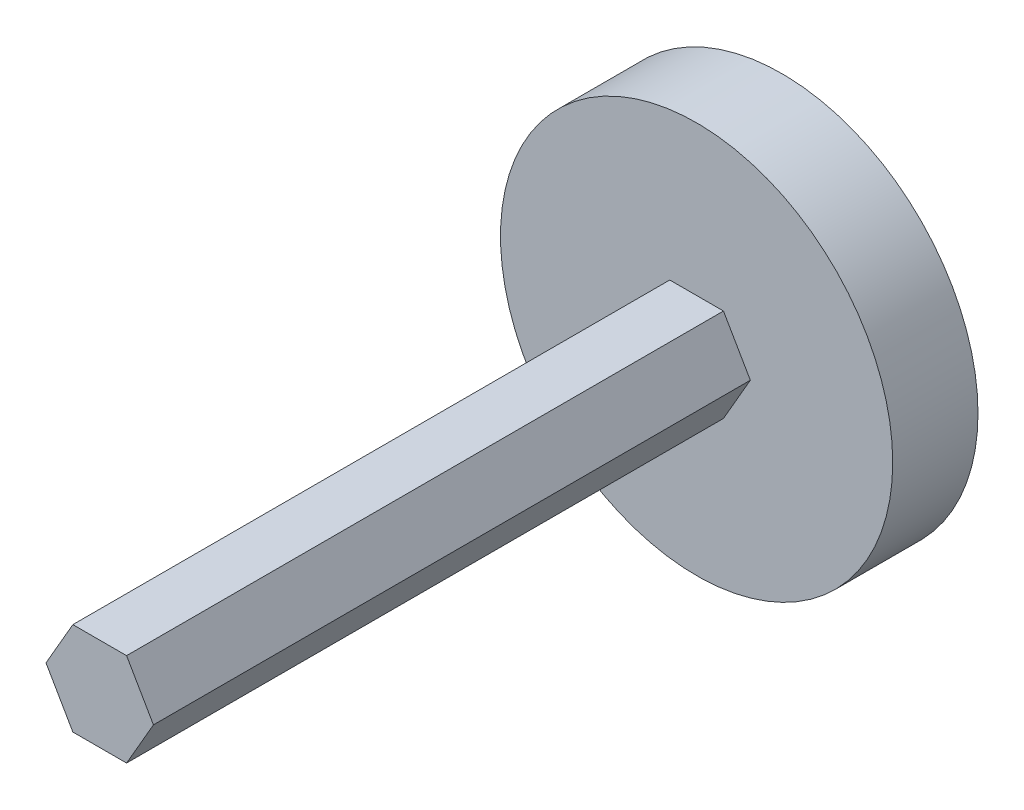
ISO-10303-21;
HEADER;
FILE_DESCRIPTION(('STEP AP214'),'2;1');
FILE_NAME('part.step','',(''),(''),'','','');
FILE_SCHEMA(('AUTOMOTIVE_DESIGN { 1 0 10303 214 1 1 1 1 }'));
ENDSEC;
DATA;
#1=APPLICATION_CONTEXT('core data for automotive mechanical design processes');
#2=APPLICATION_PROTOCOL_DEFINITION('international standard','automotive_design',2000,#1);
#3=PRODUCT_CONTEXT('',#1,'mechanical');
#4=PRODUCT('Part','Part','',(#3));
#5=PRODUCT_RELATED_PRODUCT_CATEGORY('part','',(#4));
#6=PRODUCT_DEFINITION_FORMATION('','',#4);
#7=PRODUCT_DEFINITION_CONTEXT('part definition',#1,'design');
#8=PRODUCT_DEFINITION('design','',#6,#7);
#9=PRODUCT_DEFINITION_SHAPE('','',#8);
#10=(LENGTH_UNIT() NAMED_UNIT(*) SI_UNIT(.MILLI.,.METRE.));
#11=(NAMED_UNIT(*) PLANE_ANGLE_UNIT() SI_UNIT($,.RADIAN.));
#12=(NAMED_UNIT(*) SI_UNIT($,.STERADIAN.) SOLID_ANGLE_UNIT());
#13=UNCERTAINTY_MEASURE_WITH_UNIT(LENGTH_MEASURE(1.E-05),#10,'distance_accuracy_value','');
#14=(GEOMETRIC_REPRESENTATION_CONTEXT(3) GLOBAL_UNCERTAINTY_ASSIGNED_CONTEXT((#13)) GLOBAL_UNIT_ASSIGNED_CONTEXT((#10,
#11,#12)) REPRESENTATION_CONTEXT('',''));
#15=CARTESIAN_POINT('',(0.,0.,0.));
#16=DIRECTION('',(0.,0.,1.));
#17=DIRECTION('',(1.,0.,0.));
#18=AXIS2_PLACEMENT_3D('',#15,#16,#17);
#19=CARTESIAN_POINT('',(0.,0.,10.));
#20=DIRECTION('',(0.,0.,1.));
#21=DIRECTION('',(1.,0.,0.));
#22=AXIS2_PLACEMENT_3D('',#19,#20,#21);
#23=PLANE('',#22);
#24=CARTESIAN_POINT('',(0.,0.,10.));
#25=DIRECTION('',(0.,0.,1.));
#26=DIRECTION('',(1.,0.,0.));
#27=AXIS2_PLACEMENT_3D('',#24,#25,#26);
#28=CIRCLE('',#27,23.);
#29=CARTESIAN_POINT('',(23.,0.,10.));
#30=VERTEX_POINT('',#29);
#31=EDGE_CURVE('E150',#30,#30,#28,.T.);
#32=ORIENTED_EDGE('',*,*,#31,.T.);
#33=EDGE_LOOP('',(#32));
#34=FACE_BOUND('',#33,.T.);
#35=DIRECTION('',(0.5,-0.866025403784439,0.));
#36=VECTOR('',#35,1.);
#37=CARTESIAN_POINT('',(-6.3,0.,10.));
#38=LINE('',#37,#36);
#39=CARTESIAN_POINT('',(-6.3,0.,10.));
#40=VERTEX_POINT('',#39);
#41=CARTESIAN_POINT('',(-3.15,-5.45596004384196,10.));
#42=VERTEX_POINT('',#41);
#43=EDGE_CURVE('E129',#40,#42,#38,.T.);
#44=ORIENTED_EDGE('',*,*,#43,.F.);
#45=DIRECTION('',(-0.5,-0.866025403784439,0.));
#46=VECTOR('',#45,1.);
#47=CARTESIAN_POINT('',(-3.15,5.45596004384196,10.));
#48=LINE('',#47,#46);
#49=CARTESIAN_POINT('',(-3.15,5.45596004384196,10.));
#50=VERTEX_POINT('',#49);
#51=EDGE_CURVE('E63',#50,#40,#48,.T.);
#52=ORIENTED_EDGE('',*,*,#51,.F.);
#53=DIRECTION('',(-1.,0.,0.));
#54=VECTOR('',#53,1.);
#55=CARTESIAN_POINT('',(3.15,5.45596004384196,10.));
#56=LINE('',#55,#54);
#57=CARTESIAN_POINT('',(3.15,5.45596004384196,9.99999999999999));
#58=VERTEX_POINT('',#57);
#59=EDGE_CURVE('E124',#58,#50,#56,.T.);
#60=ORIENTED_EDGE('',*,*,#59,.F.);
#61=DIRECTION('',(-0.5,0.866025403784439,0.));
#62=VECTOR('',#61,1.);
#63=CARTESIAN_POINT('',(6.3,0.,10.));
#64=LINE('',#63,#62);
#65=CARTESIAN_POINT('',(6.3,0.,10.));
#66=VERTEX_POINT('',#65);
#67=EDGE_CURVE('E69',#66,#58,#64,.T.);
#68=ORIENTED_EDGE('',*,*,#67,.F.);
#69=DIRECTION('',(0.5,0.866025403784439,0.));
#70=VECTOR('',#69,1.);
#71=CARTESIAN_POINT('',(3.15,-5.45596004384196,10.));
#72=LINE('',#71,#70);
#73=CARTESIAN_POINT('',(3.15,-5.45596004384196,10.));
#74=VERTEX_POINT('',#73);
#75=EDGE_CURVE('E142',#74,#66,#72,.T.);
#76=ORIENTED_EDGE('',*,*,#75,.F.);
#77=DIRECTION('',(1.,0.,0.));
#78=VECTOR('',#77,1.);
#79=CARTESIAN_POINT('',(-3.15,-5.45596004384196,10.));
#80=LINE('',#79,#78);
#81=EDGE_CURVE('E138',#42,#74,#80,.T.);
#82=ORIENTED_EDGE('',*,*,#81,.F.);
#83=EDGE_LOOP('',(#44,#52,#60,#68,#76,#82));
#84=FACE_BOUND('',#83,.T.);
#85=ADVANCED_FACE('F47',(#34,#84),#23,.T.);
#86=CARTESIAN_POINT('',(0.,0.,0.));
#87=DIRECTION('',(0.,0.,1.));
#88=DIRECTION('',(1.,0.,0.));
#89=AXIS2_PLACEMENT_3D('',#86,#87,#88);
#90=PLANE('',#89);
#91=CARTESIAN_POINT('',(0.,10.,0.));
#92=DIRECTION('',(0.,0.,1.));
#93=DIRECTION('',(1.,0.,0.));
#94=AXIS2_PLACEMENT_3D('',#91,#92,#93);
#95=CIRCLE('',#94,0.500000000000001);
#96=CARTESIAN_POINT('',(0.500000000000001,10.,0.));
#97=VERTEX_POINT('',#96);
#98=EDGE_CURVE('E11',#97,#97,#95,.F.);
#99=ORIENTED_EDGE('',*,*,#98,.F.);
#100=EDGE_LOOP('',(#99));
#101=FACE_BOUND('',#100,.T.);
#102=CARTESIAN_POINT('',(-7.0682595088448,7.073875,0.));
#103=DIRECTION('',(0.,0.,1.));
#104=DIRECTION('',(1.,0.,0.));
#105=AXIS2_PLACEMENT_3D('',#102,#103,#104);
#106=CIRCLE('',#105,0.500000000000002);
#107=CARTESIAN_POINT('',(-6.5682595088448,7.073875,0.));
#108=VERTEX_POINT('',#107);
#109=EDGE_CURVE('E56',#108,#108,#106,.F.);
#110=ORIENTED_EDGE('',*,*,#109,.F.);
#111=EDGE_LOOP('',(#110));
#112=FACE_BOUND('',#111,.T.);
#113=CARTESIAN_POINT('',(7.07948602984036,-7.06263955991633,0.));
#114=DIRECTION('',(0.,0.,1.));
#115=DIRECTION('',(1.,0.,0.));
#116=AXIS2_PLACEMENT_3D('',#113,#114,#115);
#117=CIRCLE('',#116,0.500000000000001);
#118=CARTESIAN_POINT('',(7.57948602984036,-7.06263955991633,0.));
#119=VERTEX_POINT('',#118);
#120=EDGE_CURVE('E177',#119,#119,#117,.F.);
#121=ORIENTED_EDGE('',*,*,#120,.F.);
#122=EDGE_LOOP('',(#121));
#123=FACE_BOUND('',#122,.T.);
#124=CARTESIAN_POINT('',(9.9999968466259,0.00794150312499915,0.));
#125=DIRECTION('',(0.,0.,1.));
#126=DIRECTION('',(1.,0.,0.));
#127=AXIS2_PLACEMENT_3D('',#124,#125,#126);
#128=CIRCLE('',#127,0.500000000000001);
#129=CARTESIAN_POINT('',(10.4999968466259,0.00794150312499915,0.));
#130=VERTEX_POINT('',#129);
#131=EDGE_CURVE('E173',#130,#130,#128,.F.);
#132=ORIENTED_EDGE('',*,*,#131,.F.);
#133=EDGE_LOOP('',(#132));
#134=FACE_BOUND('',#133,.T.);
#135=CARTESIAN_POINT('',(0.0158882464843879,-10.,0.));
#136=DIRECTION('',(0.,0.,1.));
#137=DIRECTION('',(1.,0.,0.));
#138=AXIS2_PLACEMENT_3D('',#135,#136,#137);
#139=CIRCLE('',#138,0.5);
#140=CARTESIAN_POINT('',(0.515888246484388,-10.,0.));
#141=VERTEX_POINT('',#140);
#142=EDGE_CURVE('E169',#141,#141,#139,.F.);
#143=ORIENTED_EDGE('',*,*,#142,.F.);
#144=EDGE_LOOP('',(#143));
#145=FACE_BOUND('',#144,.T.);
#146=CARTESIAN_POINT('',(-7.05700775255605,-7.0850999696803,0.));
#147=DIRECTION('',(0.,0.,1.));
#148=DIRECTION('',(1.,0.,0.));
#149=AXIS2_PLACEMENT_3D('',#146,#147,#148);
#150=CIRCLE('',#149,0.500000000000001);
#151=CARTESIAN_POINT('',(-6.55700775255605,-7.0850999696803,0.));
#152=VERTEX_POINT('',#151);
#153=EDGE_CURVE('E165',#152,#152,#150,.F.);
#154=ORIENTED_EDGE('',*,*,#153,.F.);
#155=EDGE_LOOP('',(#154));
#156=FACE_BOUND('',#155,.T.);
#157=CARTESIAN_POINT('',(-9.96148167686387,-0.00791612135362815,0.));
#158=DIRECTION('',(0.,0.,1.));
#159=DIRECTION('',(1.,0.,0.));
#160=AXIS2_PLACEMENT_3D('',#157,#158,#159);
#161=CIRCLE('',#160,0.500000000000001);
#162=CARTESIAN_POINT('',(-9.46148167686387,-0.00791612135362815,0.));
#163=VERTEX_POINT('',#162);
#164=EDGE_CURVE('E161',#163,#163,#161,.F.);
#165=ORIENTED_EDGE('',*,*,#164,.F.);
#166=EDGE_LOOP('',(#165));
#167=FACE_BOUND('',#166,.T.);
#168=CARTESIAN_POINT('',(7.0682595088448,7.073875,0.));
#169=DIRECTION('',(0.,0.,1.));
#170=DIRECTION('',(1.,0.,0.));
#171=AXIS2_PLACEMENT_3D('',#168,#169,#170);
#172=CIRCLE('',#171,0.500000000000002);
#173=CARTESIAN_POINT('',(7.56825950884481,7.073875,0.));
#174=VERTEX_POINT('',#173);
#175=EDGE_CURVE('E154',#174,#174,#172,.F.);
#176=ORIENTED_EDGE('',*,*,#175,.F.);
#177=EDGE_LOOP('',(#176));
#178=FACE_BOUND('',#177,.T.);
#179=CARTESIAN_POINT('',(0.,0.,0.));
#180=DIRECTION('',(0.,0.,1.));
#181=DIRECTION('',(1.,0.,0.));
#182=AXIS2_PLACEMENT_3D('',#179,#180,#181);
#183=CIRCLE('',#182,23.);
#184=CARTESIAN_POINT('',(23.,0.,0.));
#185=VERTEX_POINT('',#184);
#186=EDGE_CURVE('E149',#185,#185,#183,.T.);
#187=ORIENTED_EDGE('',*,*,#186,.F.);
#188=EDGE_LOOP('',(#187));
#189=FACE_BOUND('',#188,.T.);
#190=ADVANCED_FACE('F186',(#101,#112,#123,#134,#145,#156,#167,#178,#189),#90,.F.);
#191=CARTESIAN_POINT('',(0.,0.,10.));
#192=DIRECTION('',(0.,0.,-1.));
#193=DIRECTION('',(-1.,0.,0.));
#194=AXIS2_PLACEMENT_3D('',#191,#192,#193);
#195=CYLINDRICAL_SURFACE('',#194,23.);
#196=ORIENTED_EDGE('',*,*,#31,.F.);
#197=EDGE_LOOP('',(#196));
#198=FACE_BOUND('',#197,.T.);
#199=ORIENTED_EDGE('',*,*,#186,.T.);
#200=EDGE_LOOP('',(#199));
#201=FACE_BOUND('',#200,.T.);
#202=ADVANCED_FACE('F49',(#198,#201),#195,.T.);
#203=CARTESIAN_POINT('',(0.,5.45596004384196,80.));
#204=DIRECTION('',(0.,-1.,0.));
#205=DIRECTION('',(0.,0.,-1.));
#206=AXIS2_PLACEMENT_3D('',#203,#204,#205);
#207=PLANE('',#206);
#208=ORIENTED_EDGE('',*,*,#59,.T.);
#209=DIRECTION('',(0.,0.,-1.));
#210=VECTOR('',#209,1.);
#211=CARTESIAN_POINT('',(-3.15,5.45596004384196,80.));
#212=LINE('',#211,#210);
#213=CARTESIAN_POINT('',(-3.15,5.45596004384196,80.));
#214=VERTEX_POINT('',#213);
#215=EDGE_CURVE('E104',#214,#50,#212,.T.);
#216=ORIENTED_EDGE('',*,*,#215,.F.);
#217=DIRECTION('',(-1.,0.,0.));
#218=VECTOR('',#217,1.);
#219=CARTESIAN_POINT('',(0.,5.45596004384196,80.));
#220=LINE('',#219,#218);
#221=CARTESIAN_POINT('',(3.15,5.45596004384196,80.));
#222=VERTEX_POINT('',#221);
#223=EDGE_CURVE('E111',#222,#214,#220,.T.);
#224=ORIENTED_EDGE('',*,*,#223,.F.);
#225=DIRECTION('',(0.,0.,-1.));
#226=VECTOR('',#225,1.);
#227=CARTESIAN_POINT('',(3.15,5.45596004384196,80.));
#228=LINE('',#227,#226);
#229=EDGE_CURVE('E345',#222,#58,#228,.T.);
#230=ORIENTED_EDGE('',*,*,#229,.T.);
#231=EDGE_LOOP('',(#208,#216,#224,#230));
#232=FACE_BOUND('',#231,.T.);
#233=ADVANCED_FACE('F123',(#232),#207,.F.);
#234=CARTESIAN_POINT('',(-4.725,2.72798002192098,80.));
#235=DIRECTION('',(0.866025403784439,-0.5,0.));
#236=DIRECTION('',(0.5,0.866025403784439,0.));
#237=AXIS2_PLACEMENT_3D('',#234,#235,#236);
#238=PLANE('',#237);
#239=ORIENTED_EDGE('',*,*,#51,.T.);
#240=DIRECTION('',(0.,0.,-1.));
#241=VECTOR('',#240,1.);
#242=CARTESIAN_POINT('',(-6.3,0.,80.));
#243=LINE('',#242,#241);
#244=CARTESIAN_POINT('',(-6.3,0.,80.));
#245=VERTEX_POINT('',#244);
#246=EDGE_CURVE('E106',#245,#40,#243,.T.);
#247=ORIENTED_EDGE('',*,*,#246,.F.);
#248=DIRECTION('',(-0.5,-0.866025403784439,0.));
#249=VECTOR('',#248,1.);
#250=CARTESIAN_POINT('',(-4.725,2.72798002192098,80.));
#251=LINE('',#250,#249);
#252=EDGE_CURVE('E100',#214,#245,#251,.T.);
#253=ORIENTED_EDGE('',*,*,#252,.F.);
#254=ORIENTED_EDGE('',*,*,#215,.T.);
#255=EDGE_LOOP('',(#239,#247,#253,#254));
#256=FACE_BOUND('',#255,.T.);
#257=ADVANCED_FACE('F102',(#256),#238,.F.);
#258=CARTESIAN_POINT('',(-4.725,-2.72798002192098,80.));
#259=DIRECTION('',(0.866025403784439,0.5,0.));
#260=DIRECTION('',(-0.5,0.866025403784439,0.));
#261=AXIS2_PLACEMENT_3D('',#258,#259,#260);
#262=PLANE('',#261);
#263=ORIENTED_EDGE('',*,*,#43,.T.);
#264=DIRECTION('',(0.,0.,-1.));
#265=VECTOR('',#264,1.);
#266=CARTESIAN_POINT('',(-3.15,-5.45596004384196,80.));
#267=LINE('',#266,#265);
#268=CARTESIAN_POINT('',(-3.15,-5.45596004384196,80.));
#269=VERTEX_POINT('',#268);
#270=EDGE_CURVE('E131',#269,#42,#267,.T.);
#271=ORIENTED_EDGE('',*,*,#270,.F.);
#272=DIRECTION('',(0.5,-0.866025403784439,0.));
#273=VECTOR('',#272,1.);
#274=CARTESIAN_POINT('',(-4.725,-2.72798002192098,80.));
#275=LINE('',#274,#273);
#276=EDGE_CURVE('E110',#245,#269,#275,.T.);
#277=ORIENTED_EDGE('',*,*,#276,.F.);
#278=ORIENTED_EDGE('',*,*,#246,.T.);
#279=EDGE_LOOP('',(#263,#271,#277,#278));
#280=FACE_BOUND('',#279,.T.);
#281=ADVANCED_FACE('F219',(#280),#262,.F.);
#282=CARTESIAN_POINT('',(0.,-5.45596004384196,80.));
#283=DIRECTION('',(0.,1.,0.));
#284=DIRECTION('',(-1.,0.,0.));
#285=AXIS2_PLACEMENT_3D('',#282,#283,#284);
#286=PLANE('',#285);
#287=ORIENTED_EDGE('',*,*,#81,.T.);
#288=DIRECTION('',(0.,0.,-1.));
#289=VECTOR('',#288,1.);
#290=CARTESIAN_POINT('',(3.15,-5.45596004384196,80.));
#291=LINE('',#290,#289);
#292=CARTESIAN_POINT('',(3.15,-5.45596004384196,80.));
#293=VERTEX_POINT('',#292);
#294=EDGE_CURVE('E352',#293,#74,#291,.T.);
#295=ORIENTED_EDGE('',*,*,#294,.F.);
#296=DIRECTION('',(1.,0.,0.));
#297=VECTOR('',#296,1.);
#298=CARTESIAN_POINT('',(0.,-5.45596004384196,80.));
#299=LINE('',#298,#297);
#300=EDGE_CURVE('E337',#269,#293,#299,.T.);
#301=ORIENTED_EDGE('',*,*,#300,.F.);
#302=ORIENTED_EDGE('',*,*,#270,.T.);
#303=EDGE_LOOP('',(#287,#295,#301,#302));
#304=FACE_BOUND('',#303,.T.);
#305=ADVANCED_FACE('F222',(#304),#286,.F.);
#306=CARTESIAN_POINT('',(4.725,-2.72798002192098,80.));
#307=DIRECTION('',(-0.866025403784439,0.5,0.));
#308=DIRECTION('',(-0.5,-0.866025403784439,0.));
#309=AXIS2_PLACEMENT_3D('',#306,#307,#308);
#310=PLANE('',#309);
#311=ORIENTED_EDGE('',*,*,#75,.T.);
#312=DIRECTION('',(0.,0.,-1.));
#313=VECTOR('',#312,1.);
#314=CARTESIAN_POINT('',(6.3,0.,80.));
#315=LINE('',#314,#313);
#316=CARTESIAN_POINT('',(6.3,0.,80.));
#317=VERTEX_POINT('',#316);
#318=EDGE_CURVE('E348',#317,#66,#315,.T.);
#319=ORIENTED_EDGE('',*,*,#318,.F.);
#320=DIRECTION('',(0.5,0.866025403784439,0.));
#321=VECTOR('',#320,1.);
#322=CARTESIAN_POINT('',(4.725,-2.72798002192098,80.));
#323=LINE('',#322,#321);
#324=EDGE_CURVE('E340',#293,#317,#323,.T.);
#325=ORIENTED_EDGE('',*,*,#324,.F.);
#326=ORIENTED_EDGE('',*,*,#294,.T.);
#327=EDGE_LOOP('',(#311,#319,#325,#326));
#328=FACE_BOUND('',#327,.T.);
#329=ADVANCED_FACE('F226',(#328),#310,.F.);
#330=CARTESIAN_POINT('',(4.725,2.72798002192098,80.));
#331=DIRECTION('',(-0.866025403784439,-0.5,0.));
#332=DIRECTION('',(0.5,-0.866025403784439,0.));
#333=AXIS2_PLACEMENT_3D('',#330,#331,#332);
#334=PLANE('',#333);
#335=ORIENTED_EDGE('',*,*,#67,.T.);
#336=ORIENTED_EDGE('',*,*,#229,.F.);
#337=DIRECTION('',(-0.5,0.866025403784439,0.));
#338=VECTOR('',#337,1.);
#339=CARTESIAN_POINT('',(4.725,2.72798002192098,80.));
#340=LINE('',#339,#338);
#341=EDGE_CURVE('E116',#317,#222,#340,.T.);
#342=ORIENTED_EDGE('',*,*,#341,.F.);
#343=ORIENTED_EDGE('',*,*,#318,.T.);
#344=EDGE_LOOP('',(#335,#336,#342,#343));
#345=FACE_BOUND('',#344,.T.);
#346=ADVANCED_FACE('F230',(#345),#334,.F.);
#347=CARTESIAN_POINT('',(0.,0.,80.));
#348=DIRECTION('',(0.,0.,1.));
#349=DIRECTION('',(1.,0.,0.));
#350=AXIS2_PLACEMENT_3D('',#347,#348,#349);
#351=PLANE('',#350);
#352=ORIENTED_EDGE('',*,*,#223,.T.);
#353=ORIENTED_EDGE('',*,*,#252,.T.);
#354=ORIENTED_EDGE('',*,*,#276,.T.);
#355=ORIENTED_EDGE('',*,*,#300,.T.);
#356=ORIENTED_EDGE('',*,*,#324,.T.);
#357=ORIENTED_EDGE('',*,*,#341,.T.);
#358=EDGE_LOOP('',(#352,#353,#354,#355,#356,#357));
#359=FACE_BOUND('',#358,.T.);
#360=ADVANCED_FACE('F114',(#359),#351,.T.);
#361=CARTESIAN_POINT('',(7.0682595088448,7.073875,-4.99999999999999));
#362=DIRECTION('',(0.,0.,1.));
#363=DIRECTION('',(1.,0.,0.));
#364=AXIS2_PLACEMENT_3D('',#361,#362,#363);
#365=CYLINDRICAL_SURFACE('',#364,0.500000000000002);
#366=CARTESIAN_POINT('',(7.0682595088448,7.073875,-4.99999999999999));
#367=DIRECTION('',(0.,0.,-1.));
#368=DIRECTION('',(-1.,0.,0.));
#369=AXIS2_PLACEMENT_3D('',#366,#367,#368);
#370=CIRCLE('',#369,0.500000000000002);
#371=CARTESIAN_POINT('',(6.5682595088448,7.073875,-4.99999999999999));
#372=VERTEX_POINT('',#371);
#373=EDGE_CURVE('E121',#372,#372,#370,.T.);
#374=ORIENTED_EDGE('',*,*,#373,.F.);
#375=EDGE_LOOP('',(#374));
#376=FACE_BOUND('',#375,.T.);
#377=ORIENTED_EDGE('',*,*,#175,.T.);
#378=EDGE_LOOP('',(#377));
#379=FACE_BOUND('',#378,.T.);
#380=ADVANCED_FACE('F237',(#376,#379),#365,.T.);
#381=CARTESIAN_POINT('',(0.,0.,-4.99999999999999));
#382=DIRECTION('',(0.,0.,-1.));
#383=DIRECTION('',(-1.,0.,0.));
#384=AXIS2_PLACEMENT_3D('',#381,#382,#383);
#385=PLANE('',#384);
#386=ORIENTED_EDGE('',*,*,#373,.T.);
#387=EDGE_LOOP('',(#386));
#388=FACE_BOUND('',#387,.T.);
#389=ADVANCED_FACE('F240',(#388),#385,.T.);
#390=CARTESIAN_POINT('',(-9.96148167686387,-0.00791612135362815,-4.99999999999999));
#391=DIRECTION('',(0.,0.,1.));
#392=DIRECTION('',(1.,0.,0.));
#393=AXIS2_PLACEMENT_3D('',#390,#391,#392);
#394=CYLINDRICAL_SURFACE('',#393,0.500000000000001);
#395=CARTESIAN_POINT('',(-9.96148167686387,-0.00791612135362815,-4.99999999999999));
#396=DIRECTION('',(0.,0.,-1.));
#397=DIRECTION('',(-1.,0.,0.));
#398=AXIS2_PLACEMENT_3D('',#395,#396,#397);
#399=CIRCLE('',#398,0.500000000000001);
#400=CARTESIAN_POINT('',(-10.4614816768639,-0.00791612135362815,-4.99999999999999));
#401=VERTEX_POINT('',#400);
#402=EDGE_CURVE('E315',#401,#401,#399,.T.);
#403=ORIENTED_EDGE('',*,*,#402,.F.);
#404=EDGE_LOOP('',(#403));
#405=FACE_BOUND('',#404,.T.);
#406=ORIENTED_EDGE('',*,*,#164,.T.);
#407=EDGE_LOOP('',(#406));
#408=FACE_BOUND('',#407,.T.);
#409=ADVANCED_FACE('F244',(#405,#408),#394,.T.);
#410=CARTESIAN_POINT('',(-9.96148167686387,-0.00791612135362815,-4.99999999999999));
#411=DIRECTION('',(0.,0.,-1.));
#412=DIRECTION('',(-1.,0.,0.));
#413=AXIS2_PLACEMENT_3D('',#410,#411,#412);
#414=PLANE('',#413);
#415=ORIENTED_EDGE('',*,*,#402,.T.);
#416=EDGE_LOOP('',(#415));
#417=FACE_BOUND('',#416,.T.);
#418=ADVANCED_FACE('F278',(#417),#414,.T.);
#419=CARTESIAN_POINT('',(-7.05700775255605,-7.0850999696803,-4.99999999999999));
#420=DIRECTION('',(0.,0.,1.));
#421=DIRECTION('',(1.,0.,0.));
#422=AXIS2_PLACEMENT_3D('',#419,#420,#421);
#423=CYLINDRICAL_SURFACE('',#422,0.500000000000001);
#424=CARTESIAN_POINT('',(-7.05700775255605,-7.0850999696803,-4.99999999999999));
#425=DIRECTION('',(0.,0.,-1.));
#426=DIRECTION('',(-1.,0.,0.));
#427=AXIS2_PLACEMENT_3D('',#424,#425,#426);
#428=CIRCLE('',#427,0.500000000000001);
#429=CARTESIAN_POINT('',(-7.55700775255605,-7.0850999696803,-4.99999999999999));
#430=VERTEX_POINT('',#429);
#431=EDGE_CURVE('E307',#430,#430,#428,.T.);
#432=ORIENTED_EDGE('',*,*,#431,.F.);
#433=EDGE_LOOP('',(#432));
#434=FACE_BOUND('',#433,.T.);
#435=ORIENTED_EDGE('',*,*,#153,.T.);
#436=EDGE_LOOP('',(#435));
#437=FACE_BOUND('',#436,.T.);
#438=ADVANCED_FACE('F281',(#434,#437),#423,.T.);
#439=CARTESIAN_POINT('',(-7.05700775255605,-7.0850999696803,-4.99999999999999));
#440=DIRECTION('',(0.,0.,-1.));
#441=DIRECTION('',(-1.,0.,0.));
#442=AXIS2_PLACEMENT_3D('',#439,#440,#441);
#443=PLANE('',#442);
#444=ORIENTED_EDGE('',*,*,#431,.T.);
#445=EDGE_LOOP('',(#444));
#446=FACE_BOUND('',#445,.T.);
#447=ADVANCED_FACE('F286',(#446),#443,.T.);
#448=CARTESIAN_POINT('',(0.0158882464843879,-10.,-4.99999999999999));
#449=DIRECTION('',(0.,0.,1.));
#450=DIRECTION('',(1.,0.,0.));
#451=AXIS2_PLACEMENT_3D('',#448,#449,#450);
#452=CYLINDRICAL_SURFACE('',#451,0.5);
#453=CARTESIAN_POINT('',(0.0158882464843879,-10.,-4.99999999999999));
#454=DIRECTION('',(0.,0.,-1.));
#455=DIRECTION('',(-1.,0.,0.));
#456=AXIS2_PLACEMENT_3D('',#453,#454,#455);
#457=CIRCLE('',#456,0.5);
#458=CARTESIAN_POINT('',(-0.484111753515612,-10.,-4.99999999999999));
#459=VERTEX_POINT('',#458);
#460=EDGE_CURVE('E304',#459,#459,#457,.T.);
#461=ORIENTED_EDGE('',*,*,#460,.F.);
#462=EDGE_LOOP('',(#461));
#463=FACE_BOUND('',#462,.T.);
#464=ORIENTED_EDGE('',*,*,#142,.T.);
#465=EDGE_LOOP('',(#464));
#466=FACE_BOUND('',#465,.T.);
#467=ADVANCED_FACE('F289',(#463,#466),#452,.T.);
#468=CARTESIAN_POINT('',(0.0158882464843879,-10.,-4.99999999999999));
#469=DIRECTION('',(0.,0.,-1.));
#470=DIRECTION('',(-1.,0.,0.));
#471=AXIS2_PLACEMENT_3D('',#468,#469,#470);
#472=PLANE('',#471);
#473=ORIENTED_EDGE('',*,*,#460,.T.);
#474=EDGE_LOOP('',(#473));
#475=FACE_BOUND('',#474,.T.);
#476=ADVANCED_FACE('F254',(#475),#472,.T.);
#477=CARTESIAN_POINT('',(9.9999968466259,0.00794150312499915,-4.99999999999999));
#478=DIRECTION('',(0.,0.,1.));
#479=DIRECTION('',(1.,0.,0.));
#480=AXIS2_PLACEMENT_3D('',#477,#478,#479);
#481=CYLINDRICAL_SURFACE('',#480,0.500000000000001);
#482=CARTESIAN_POINT('',(9.9999968466259,0.00794150312499915,-4.99999999999999));
#483=DIRECTION('',(0.,0.,-1.));
#484=DIRECTION('',(-1.,0.,0.));
#485=AXIS2_PLACEMENT_3D('',#482,#483,#484);
#486=CIRCLE('',#485,0.500000000000001);
#487=CARTESIAN_POINT('',(9.4999968466259,0.00794150312499915,-4.99999999999999));
#488=VERTEX_POINT('',#487);
#489=EDGE_CURVE('E306',#488,#488,#486,.T.);
#490=ORIENTED_EDGE('',*,*,#489,.F.);
#491=EDGE_LOOP('',(#490));
#492=FACE_BOUND('',#491,.T.);
#493=ORIENTED_EDGE('',*,*,#131,.T.);
#494=EDGE_LOOP('',(#493));
#495=FACE_BOUND('',#494,.T.);
#496=ADVANCED_FACE('F250',(#492,#495),#481,.T.);
#497=CARTESIAN_POINT('',(9.9999968466259,0.00794150312499915,-4.99999999999999));
#498=DIRECTION('',(0.,0.,-1.));
#499=DIRECTION('',(-1.,0.,0.));
#500=AXIS2_PLACEMENT_3D('',#497,#498,#499);
#501=PLANE('',#500);
#502=ORIENTED_EDGE('',*,*,#489,.T.);
#503=EDGE_LOOP('',(#502));
#504=FACE_BOUND('',#503,.T.);
#505=ADVANCED_FACE('F246',(#504),#501,.T.);
#506=CARTESIAN_POINT('',(7.07948602984036,-7.06263955991633,-4.99999999999999));
#507=DIRECTION('',(0.,0.,1.));
#508=DIRECTION('',(1.,0.,0.));
#509=AXIS2_PLACEMENT_3D('',#506,#507,#508);
#510=CYLINDRICAL_SURFACE('',#509,0.500000000000001);
#511=CARTESIAN_POINT('',(7.07948602984036,-7.06263955991633,-4.99999999999999));
#512=DIRECTION('',(0.,0.,-1.));
#513=DIRECTION('',(-1.,0.,0.));
#514=AXIS2_PLACEMENT_3D('',#511,#512,#513);
#515=CIRCLE('',#514,0.500000000000001);
#516=CARTESIAN_POINT('',(6.57948602984036,-7.06263955991633,-4.99999999999999));
#517=VERTEX_POINT('',#516);
#518=EDGE_CURVE('E312',#517,#517,#515,.T.);
#519=ORIENTED_EDGE('',*,*,#518,.F.);
#520=EDGE_LOOP('',(#519));
#521=FACE_BOUND('',#520,.T.);
#522=ORIENTED_EDGE('',*,*,#120,.T.);
#523=EDGE_LOOP('',(#522));
#524=FACE_BOUND('',#523,.T.);
#525=ADVANCED_FACE('F249',(#521,#524),#510,.T.);
#526=CARTESIAN_POINT('',(0.,0.,-4.99999999999999));
#527=DIRECTION('',(0.,0.,-1.));
#528=DIRECTION('',(-1.,0.,0.));
#529=AXIS2_PLACEMENT_3D('',#526,#527,#528);
#530=PLANE('',#529);
#531=ORIENTED_EDGE('',*,*,#518,.T.);
#532=EDGE_LOOP('',(#531));
#533=FACE_BOUND('',#532,.T.);
#534=ADVANCED_FACE('F256',(#533),#530,.T.);
#535=CARTESIAN_POINT('',(-7.0682595088448,7.073875,-4.99999999999999));
#536=DIRECTION('',(0.,0.,1.));
#537=DIRECTION('',(1.,0.,0.));
#538=AXIS2_PLACEMENT_3D('',#535,#536,#537);
#539=CYLINDRICAL_SURFACE('',#538,0.500000000000002);
#540=CARTESIAN_POINT('',(-7.0682595088448,7.073875,-4.99999999999999));
#541=DIRECTION('',(0.,0.,-1.));
#542=DIRECTION('',(-1.,0.,0.));
#543=AXIS2_PLACEMENT_3D('',#540,#541,#542);
#544=CIRCLE('',#543,0.500000000000002);
#545=CARTESIAN_POINT('',(-7.56825950884481,7.073875,-4.99999999999999));
#546=VERTEX_POINT('',#545);
#547=EDGE_CURVE('E325',#546,#546,#544,.T.);
#548=ORIENTED_EDGE('',*,*,#547,.F.);
#549=EDGE_LOOP('',(#548));
#550=FACE_BOUND('',#549,.T.);
#551=ORIENTED_EDGE('',*,*,#109,.T.);
#552=EDGE_LOOP('',(#551));
#553=FACE_BOUND('',#552,.T.);
#554=ADVANCED_FACE('F184',(#550,#553),#539,.T.);
#555=CARTESIAN_POINT('',(0.,0.,-4.99999999999999));
#556=DIRECTION('',(0.,0.,-1.));
#557=DIRECTION('',(-1.,0.,0.));
#558=AXIS2_PLACEMENT_3D('',#555,#556,#557);
#559=PLANE('',#558);
#560=ORIENTED_EDGE('',*,*,#547,.T.);
#561=EDGE_LOOP('',(#560));
#562=FACE_BOUND('',#561,.T.);
#563=ADVANCED_FACE('F263',(#562),#559,.T.);
#564=CARTESIAN_POINT('',(0.,10.,-4.99999999999999));
#565=DIRECTION('',(0.,0.,1.));
#566=DIRECTION('',(1.,0.,0.));
#567=AXIS2_PLACEMENT_3D('',#564,#565,#566);
#568=CYLINDRICAL_SURFACE('',#567,0.500000000000001);
#569=CARTESIAN_POINT('',(0.,10.,-4.99999999999999));
#570=DIRECTION('',(0.,0.,-1.));
#571=DIRECTION('',(-1.,0.,0.));
#572=AXIS2_PLACEMENT_3D('',#569,#570,#571);
#573=CIRCLE('',#572,0.500000000000001);
#574=CARTESIAN_POINT('',(-0.500000000000001,10.,-4.99999999999999));
#575=VERTEX_POINT('',#574);
#576=EDGE_CURVE('E321',#575,#575,#573,.T.);
#577=ORIENTED_EDGE('',*,*,#576,.F.);
#578=EDGE_LOOP('',(#577));
#579=FACE_BOUND('',#578,.T.);
#580=ORIENTED_EDGE('',*,*,#98,.T.);
#581=EDGE_LOOP('',(#580));
#582=FACE_BOUND('',#581,.T.);
#583=ADVANCED_FACE('F266',(#579,#582),#568,.T.);
#584=CARTESIAN_POINT('',(0.,0.,-4.99999999999999));
#585=DIRECTION('',(0.,0.,-1.));
#586=DIRECTION('',(-1.,0.,0.));
#587=AXIS2_PLACEMENT_3D('',#584,#585,#586);
#588=PLANE('',#587);
#589=ORIENTED_EDGE('',*,*,#576,.T.);
#590=EDGE_LOOP('',(#589));
#591=FACE_BOUND('',#590,.T.);
#592=ADVANCED_FACE('F271',(#591),#588,.T.);
#593=CLOSED_SHELL('',(#85,#190,#202,#233,#257,#281,#305,#329,#346,#360,#380,#389,#409,#418,#438,
#447,#467,#476,#496,#505,#525,#534,#554,#563,#583,#592));
#594=MANIFOLD_SOLID_BREP('B2',#593);
#595=ADVANCED_BREP_SHAPE_REPRESENTATION('',(#18,#594),#14);
#596=SHAPE_DEFINITION_REPRESENTATION(#9,#595);
ENDSEC;
END-ISO-10303-21;
